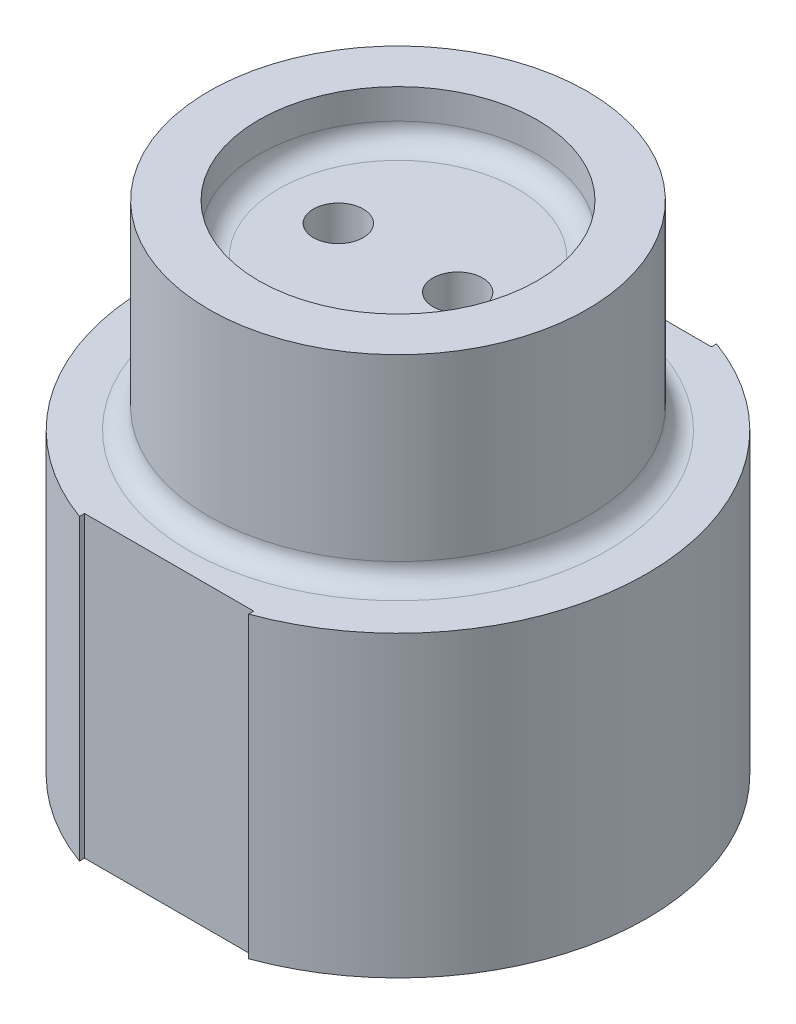
ISO-10303-21;
HEADER;
FILE_DESCRIPTION(('STEP AP214'),'2;1');
FILE_NAME('part.step','',(''),(''),'','','');
FILE_SCHEMA(('AUTOMOTIVE_DESIGN { 1 0 10303 214 1 1 1 1 }'));
ENDSEC;
DATA;
#1=APPLICATION_CONTEXT('core data for automotive mechanical design processes');
#2=APPLICATION_PROTOCOL_DEFINITION('international standard','automotive_design',2000,#1);
#3=PRODUCT_CONTEXT('',#1,'mechanical');
#4=PRODUCT('Part','Part','',(#3));
#5=PRODUCT_RELATED_PRODUCT_CATEGORY('part','',(#4));
#6=PRODUCT_DEFINITION_FORMATION('','',#4);
#7=PRODUCT_DEFINITION_CONTEXT('part definition',#1,'design');
#8=PRODUCT_DEFINITION('design','',#6,#7);
#9=PRODUCT_DEFINITION_SHAPE('','',#8);
#10=(LENGTH_UNIT() NAMED_UNIT(*) SI_UNIT(.MILLI.,.METRE.));
#11=(NAMED_UNIT(*) PLANE_ANGLE_UNIT() SI_UNIT($,.RADIAN.));
#12=(NAMED_UNIT(*) SI_UNIT($,.STERADIAN.) SOLID_ANGLE_UNIT());
#13=UNCERTAINTY_MEASURE_WITH_UNIT(LENGTH_MEASURE(1.E-05),#10,'distance_accuracy_value','');
#14=(GEOMETRIC_REPRESENTATION_CONTEXT(3) GLOBAL_UNCERTAINTY_ASSIGNED_CONTEXT((#13)) GLOBAL_UNIT_ASSIGNED_CONTEXT((#10,
#11,#12)) REPRESENTATION_CONTEXT('',''));
#15=CARTESIAN_POINT('',(0.,0.,0.));
#16=DIRECTION('',(0.,0.,1.));
#17=DIRECTION('',(1.,0.,0.));
#18=AXIS2_PLACEMENT_3D('',#15,#16,#17);
#19=CARTESIAN_POINT('',(0.,0.,0.));
#20=DIRECTION('',(0.,-1.,0.));
#21=DIRECTION('',(0.,0.,-1.));
#22=AXIS2_PLACEMENT_3D('',#19,#20,#21);
#23=PLANE('',#22);
#24=CARTESIAN_POINT('',(-1300.,0.,0.));
#25=DIRECTION('',(0.,-1.,0.));
#26=DIRECTION('',(0.,0.,1.));
#27=AXIS2_PLACEMENT_3D('',#24,#25,#26);
#28=CIRCLE('',#27,250.);
#29=CARTESIAN_POINT('',(-1300.,0.,250.));
#30=VERTEX_POINT('',#29);
#31=EDGE_CURVE('E181',#30,#30,#28,.T.);
#32=ORIENTED_EDGE('',*,*,#31,.F.);
#33=EDGE_LOOP('',(#32));
#34=FACE_BOUND('',#33,.T.);
#35=CARTESIAN_POINT('',(1300.,0.,0.));
#36=DIRECTION('',(0.,1.,0.));
#37=DIRECTION('',(0.,0.,1.));
#38=AXIS2_PLACEMENT_3D('',#35,#36,#37);
#39=CIRCLE('',#38,250.);
#40=CARTESIAN_POINT('',(1300.,0.,250.));
#41=VERTEX_POINT('',#40);
#42=EDGE_CURVE('E202',#41,#41,#39,.T.);
#43=ORIENTED_EDGE('',*,*,#42,.T.);
#44=EDGE_LOOP('',(#43));
#45=FACE_BOUND('',#44,.T.);
#46=CARTESIAN_POINT('',(0.,0.,0.));
#47=DIRECTION('',(0.,-1.,0.));
#48=DIRECTION('',(0.,0.,-1.));
#49=AXIS2_PLACEMENT_3D('',#46,#47,#48);
#50=CIRCLE('',#49,2500.);
#51=CARTESIAN_POINT('',(-850.,0.,2351.06358910175));
#52=VERTEX_POINT('',#51);
#53=CARTESIAN_POINT('',(-850.,0.,-2351.06358910175));
#54=VERTEX_POINT('',#53);
#55=EDGE_CURVE('E253',#52,#54,#50,.T.);
#56=ORIENTED_EDGE('',*,*,#55,.T.);
#57=DIRECTION('',(0.,0.,-1.));
#58=VECTOR('',#57,1.);
#59=CARTESIAN_POINT('',(-850.,0.,-2300.));
#60=LINE('',#59,#58);
#61=CARTESIAN_POINT('',(-850.,0.,-2300.));
#62=VERTEX_POINT('',#61);
#63=EDGE_CURVE('E135',#62,#54,#60,.T.);
#64=ORIENTED_EDGE('',*,*,#63,.F.);
#65=DIRECTION('',(1.,0.,0.));
#66=VECTOR('',#65,1.);
#67=CARTESIAN_POINT('',(-850.,0.,-2300.));
#68=LINE('',#67,#66);
#69=CARTESIAN_POINT('',(850.,0.,-2300.));
#70=VERTEX_POINT('',#69);
#71=EDGE_CURVE('E117',#62,#70,#68,.T.);
#72=ORIENTED_EDGE('',*,*,#71,.T.);
#73=DIRECTION('',(0.,0.,-1.));
#74=VECTOR('',#73,1.);
#75=CARTESIAN_POINT('',(850.,0.,-2300.));
#76=LINE('',#75,#74);
#77=CARTESIAN_POINT('',(850.,0.,-2351.06358910175));
#78=VERTEX_POINT('',#77);
#79=EDGE_CURVE('E114',#70,#78,#76,.T.);
#80=ORIENTED_EDGE('',*,*,#79,.T.);
#81=CARTESIAN_POINT('',(850.,0.,2351.06358910175));
#82=VERTEX_POINT('',#81);
#83=EDGE_CURVE('E252',#78,#82,#50,.T.);
#84=ORIENTED_EDGE('',*,*,#83,.T.);
#85=DIRECTION('',(0.,0.,1.));
#86=VECTOR('',#85,1.);
#87=CARTESIAN_POINT('',(850.,0.,2300.));
#88=LINE('',#87,#86);
#89=CARTESIAN_POINT('',(850.,0.,2300.));
#90=VERTEX_POINT('',#89);
#91=EDGE_CURVE('E167',#90,#82,#88,.T.);
#92=ORIENTED_EDGE('',*,*,#91,.F.);
#93=DIRECTION('',(1.,0.,0.));
#94=VECTOR('',#93,1.);
#95=CARTESIAN_POINT('',(-850.,0.,2300.));
#96=LINE('',#95,#94);
#97=CARTESIAN_POINT('',(-850.,0.,2300.));
#98=VERTEX_POINT('',#97);
#99=EDGE_CURVE('E151',#98,#90,#96,.T.);
#100=ORIENTED_EDGE('',*,*,#99,.F.);
#101=DIRECTION('',(0.,0.,1.));
#102=VECTOR('',#101,1.);
#103=CARTESIAN_POINT('',(-850.,0.,2300.));
#104=LINE('',#103,#102);
#105=EDGE_CURVE('E159',#98,#52,#104,.T.);
#106=ORIENTED_EDGE('',*,*,#105,.T.);
#107=EDGE_LOOP('',(#56,#64,#72,#80,#84,#92,#100,#106));
#108=FACE_BOUND('',#107,.T.);
#109=ADVANCED_FACE('F40',(#34,#45,#108),#23,.T.);
#110=CARTESIAN_POINT('',(0.,0.,0.));
#111=DIRECTION('',(0.,-1.,0.));
#112=DIRECTION('',(0.,0.,-1.));
#113=AXIS2_PLACEMENT_3D('',#110,#111,#112);
#114=CYLINDRICAL_SURFACE('',#113,2500.);
#115=CARTESIAN_POINT('',(0.,3000.,0.));
#116=DIRECTION('',(0.,-1.,0.));
#117=DIRECTION('',(0.,0.,-1.));
#118=AXIS2_PLACEMENT_3D('',#115,#116,#117);
#119=CIRCLE('',#118,2500.);
#120=CARTESIAN_POINT('',(-850.,3000.,2351.06358910175));
#121=VERTEX_POINT('',#120);
#122=CARTESIAN_POINT('',(-850.,3000.,-2351.06358910175));
#123=VERTEX_POINT('',#122);
#124=EDGE_CURVE('E248',#121,#123,#119,.T.);
#125=ORIENTED_EDGE('',*,*,#124,.T.);
#126=DIRECTION('',(0.,-1.,0.));
#127=VECTOR('',#126,1.);
#128=CARTESIAN_POINT('',(-850.,0.,-2351.06358910175));
#129=LINE('',#128,#127);
#130=EDGE_CURVE('E143',#123,#54,#129,.T.);
#131=ORIENTED_EDGE('',*,*,#130,.T.);
#132=ORIENTED_EDGE('',*,*,#55,.F.);
#133=DIRECTION('',(0.,-1.,0.));
#134=VECTOR('',#133,1.);
#135=CARTESIAN_POINT('',(-850.,0.,2351.06358910175));
#136=LINE('',#135,#134);
#137=EDGE_CURVE('E177',#121,#52,#136,.T.);
#138=ORIENTED_EDGE('',*,*,#137,.F.);
#139=EDGE_LOOP('',(#125,#131,#132,#138));
#140=FACE_BOUND('',#139,.T.);
#141=ADVANCED_FACE('F299',(#140),#114,.T.);
#142=ORIENTED_EDGE('',*,*,#83,.F.);
#143=DIRECTION('',(0.,-1.,0.));
#144=VECTOR('',#143,1.);
#145=CARTESIAN_POINT('',(850.,0.,-2351.06358910175));
#146=LINE('',#145,#144);
#147=CARTESIAN_POINT('',(850.,3000.,-2351.06358910175));
#148=VERTEX_POINT('',#147);
#149=EDGE_CURVE('E140',#78,#148,#146,.F.);
#150=ORIENTED_EDGE('',*,*,#149,.T.);
#151=CARTESIAN_POINT('',(850.,3000.,2351.06358910175));
#152=VERTEX_POINT('',#151);
#153=EDGE_CURVE('E129',#148,#152,#119,.T.);
#154=ORIENTED_EDGE('',*,*,#153,.T.);
#155=DIRECTION('',(0.,-1.,0.));
#156=VECTOR('',#155,1.);
#157=CARTESIAN_POINT('',(850.,0.,2351.06358910175));
#158=LINE('',#157,#156);
#159=EDGE_CURVE('E163',#82,#152,#158,.F.);
#160=ORIENTED_EDGE('',*,*,#159,.F.);
#161=EDGE_LOOP('',(#142,#150,#154,#160));
#162=FACE_BOUND('',#161,.T.);
#163=ADVANCED_FACE('F305',(#162),#114,.T.);
#164=CARTESIAN_POINT('',(2500.,3000.,0.));
#165=DIRECTION('',(0.,1.,0.));
#166=DIRECTION('',(0.,0.,1.));
#167=AXIS2_PLACEMENT_3D('',#164,#165,#166);
#168=PLANE('',#167);
#169=CARTESIAN_POINT('',(0.,3000.,0.));
#170=DIRECTION('',(0.,1.,0.));
#171=DIRECTION('',(0.,0.,1.));
#172=AXIS2_PLACEMENT_3D('',#169,#170,#171);
#173=CIRCLE('',#172,2100.);
#174=CARTESIAN_POINT('',(0.,3000.,2100.));
#175=VERTEX_POINT('',#174);
#176=EDGE_CURVE('E50',#175,#175,#173,.F.);
#177=ORIENTED_EDGE('',*,*,#176,.T.);
#178=EDGE_LOOP('',(#177));
#179=FACE_BOUND('',#178,.T.);
#180=DIRECTION('',(-1.,0.,0.));
#181=VECTOR('',#180,1.);
#182=CARTESIAN_POINT('',(-850.,3000.,-2300.));
#183=LINE('',#182,#181);
#184=CARTESIAN_POINT('',(850.,3000.,-2300.));
#185=VERTEX_POINT('',#184);
#186=CARTESIAN_POINT('',(-850.,3000.,-2300.));
#187=VERTEX_POINT('',#186);
#188=EDGE_CURVE('E118',#185,#187,#183,.T.);
#189=ORIENTED_EDGE('',*,*,#188,.T.);
#190=DIRECTION('',(0.,0.,-1.));
#191=VECTOR('',#190,1.);
#192=CARTESIAN_POINT('',(-850.,3000.,-2300.));
#193=LINE('',#192,#191);
#194=EDGE_CURVE('E131',#187,#123,#193,.T.);
#195=ORIENTED_EDGE('',*,*,#194,.T.);
#196=ORIENTED_EDGE('',*,*,#124,.F.);
#197=DIRECTION('',(0.,0.,1.));
#198=VECTOR('',#197,1.);
#199=CARTESIAN_POINT('',(-850.,3000.,2300.));
#200=LINE('',#199,#198);
#201=CARTESIAN_POINT('',(-850.,3000.,2300.));
#202=VERTEX_POINT('',#201);
#203=EDGE_CURVE('E160',#202,#121,#200,.T.);
#204=ORIENTED_EDGE('',*,*,#203,.F.);
#205=DIRECTION('',(-1.,0.,0.));
#206=VECTOR('',#205,1.);
#207=CARTESIAN_POINT('',(-850.,3000.,2300.));
#208=LINE('',#207,#206);
#209=CARTESIAN_POINT('',(850.,3000.,2300.));
#210=VERTEX_POINT('',#209);
#211=EDGE_CURVE('E156',#210,#202,#208,.T.);
#212=ORIENTED_EDGE('',*,*,#211,.F.);
#213=DIRECTION('',(0.,0.,1.));
#214=VECTOR('',#213,1.);
#215=CARTESIAN_POINT('',(850.,3000.,2300.));
#216=LINE('',#215,#214);
#217=EDGE_CURVE('E164',#210,#152,#216,.T.);
#218=ORIENTED_EDGE('',*,*,#217,.T.);
#219=ORIENTED_EDGE('',*,*,#153,.F.);
#220=DIRECTION('',(0.,0.,-1.));
#221=VECTOR('',#220,1.);
#222=CARTESIAN_POINT('',(850.,3000.,-2300.));
#223=LINE('',#222,#221);
#224=EDGE_CURVE('E111',#185,#148,#223,.T.);
#225=ORIENTED_EDGE('',*,*,#224,.F.);
#226=EDGE_LOOP('',(#189,#195,#196,#204,#212,#218,#219,#225));
#227=FACE_BOUND('',#226,.T.);
#228=ADVANCED_FACE('F127',(#179,#227),#168,.T.);
#229=CARTESIAN_POINT('',(0.,0.,0.));
#230=DIRECTION('',(0.,-1.,0.));
#231=DIRECTION('',(0.,0.,-1.));
#232=AXIS2_PLACEMENT_3D('',#229,#230,#231);
#233=CYLINDRICAL_SURFACE('',#232,1900.);
#234=CARTESIAN_POINT('',(0.,3200.,0.));
#235=DIRECTION('',(0.,1.,0.));
#236=DIRECTION('',(0.,0.,1.));
#237=AXIS2_PLACEMENT_3D('',#234,#235,#236);
#238=CIRCLE('',#237,1900.);
#239=CARTESIAN_POINT('',(0.,3200.,1900.));
#240=VERTEX_POINT('',#239);
#241=EDGE_CURVE('E11',#240,#240,#238,.T.);
#242=ORIENTED_EDGE('',*,*,#241,.T.);
#243=EDGE_LOOP('',(#242));
#244=FACE_BOUND('',#243,.T.);
#245=CARTESIAN_POINT('',(0.,5000.,0.));
#246=DIRECTION('',(0.,-1.,0.));
#247=DIRECTION('',(0.,0.,-1.));
#248=AXIS2_PLACEMENT_3D('',#245,#246,#247);
#249=CIRCLE('',#248,1900.);
#250=CARTESIAN_POINT('',(0.,5000.,-1900.));
#251=VERTEX_POINT('',#250);
#252=EDGE_CURVE('E244',#251,#251,#249,.T.);
#253=ORIENTED_EDGE('',*,*,#252,.T.);
#254=EDGE_LOOP('',(#253));
#255=FACE_BOUND('',#254,.T.);
#256=ADVANCED_FACE('F313',(#244,#255),#233,.T.);
#257=CARTESIAN_POINT('',(1900.,5000.,0.));
#258=DIRECTION('',(0.,1.,0.));
#259=DIRECTION('',(0.,0.,1.));
#260=AXIS2_PLACEMENT_3D('',#257,#258,#259);
#261=PLANE('',#260);
#262=CARTESIAN_POINT('',(0.,5000.,0.));
#263=DIRECTION('',(0.,-1.,0.));
#264=DIRECTION('',(0.,0.,-1.));
#265=AXIS2_PLACEMENT_3D('',#262,#263,#264);
#266=CIRCLE('',#265,1400.);
#267=CARTESIAN_POINT('',(0.,5000.,-1400.));
#268=VERTEX_POINT('',#267);
#269=EDGE_CURVE('E240',#268,#268,#266,.T.);
#270=ORIENTED_EDGE('',*,*,#269,.T.);
#271=EDGE_LOOP('',(#270));
#272=FACE_BOUND('',#271,.T.);
#273=ORIENTED_EDGE('',*,*,#252,.F.);
#274=EDGE_LOOP('',(#273));
#275=FACE_BOUND('',#274,.T.);
#276=ADVANCED_FACE('F316',(#272,#275),#261,.T.);
#277=CARTESIAN_POINT('',(0.,0.,0.));
#278=DIRECTION('',(0.,-1.,0.));
#279=DIRECTION('',(0.,0.,-1.));
#280=AXIS2_PLACEMENT_3D('',#277,#278,#279);
#281=CYLINDRICAL_SURFACE('',#280,1400.);
#282=CARTESIAN_POINT('',(0.,4700.,0.));
#283=DIRECTION('',(0.,1.,0.));
#284=DIRECTION('',(0.,0.,1.));
#285=AXIS2_PLACEMENT_3D('',#282,#283,#284);
#286=CIRCLE('',#285,1400.);
#287=CARTESIAN_POINT('',(0.,4700.,1400.));
#288=VERTEX_POINT('',#287);
#289=EDGE_CURVE('E281',#288,#288,#286,.F.);
#290=ORIENTED_EDGE('',*,*,#289,.T.);
#291=EDGE_LOOP('',(#290));
#292=FACE_BOUND('',#291,.T.);
#293=ORIENTED_EDGE('',*,*,#269,.F.);
#294=EDGE_LOOP('',(#293));
#295=FACE_BOUND('',#294,.T.);
#296=ADVANCED_FACE('F320',(#292,#295),#281,.F.);
#297=CARTESIAN_POINT('',(0.,4500.,0.));
#298=DIRECTION('',(0.,1.,0.));
#299=DIRECTION('',(0.,0.,1.));
#300=AXIS2_PLACEMENT_3D('',#297,#298,#299);
#301=PLANE('',#300);
#302=CARTESIAN_POINT('',(0.,4500.,0.));
#303=DIRECTION('',(0.,1.,0.));
#304=DIRECTION('',(0.,0.,1.));
#305=AXIS2_PLACEMENT_3D('',#302,#303,#304);
#306=CIRCLE('',#305,1200.);
#307=CARTESIAN_POINT('',(0.,4500.,1200.));
#308=VERTEX_POINT('',#307);
#309=EDGE_CURVE('E274',#308,#308,#306,.T.);
#310=ORIENTED_EDGE('',*,*,#309,.T.);
#311=EDGE_LOOP('',(#310));
#312=FACE_BOUND('',#311,.T.);
#313=CARTESIAN_POINT('',(-600.,4500.,0.));
#314=DIRECTION('',(0.,1.,0.));
#315=DIRECTION('',(0.,0.,1.));
#316=AXIS2_PLACEMENT_3D('',#313,#314,#315);
#317=CIRCLE('',#316,250.);
#318=CARTESIAN_POINT('',(-600.,4500.,250.));
#319=VERTEX_POINT('',#318);
#320=EDGE_CURVE('E180',#319,#319,#317,.F.);
#321=ORIENTED_EDGE('',*,*,#320,.T.);
#322=EDGE_LOOP('',(#321));
#323=FACE_BOUND('',#322,.T.);
#324=CARTESIAN_POINT('',(600.,4500.,0.));
#325=DIRECTION('',(0.,1.,0.));
#326=DIRECTION('',(0.,0.,1.));
#327=AXIS2_PLACEMENT_3D('',#324,#325,#326);
#328=CIRCLE('',#327,250.);
#329=CARTESIAN_POINT('',(600.,4500.,250.));
#330=VERTEX_POINT('',#329);
#331=EDGE_CURVE('E207',#330,#330,#328,.T.);
#332=ORIENTED_EDGE('',*,*,#331,.F.);
#333=EDGE_LOOP('',(#332));
#334=FACE_BOUND('',#333,.T.);
#335=ADVANCED_FACE('F324',(#312,#323,#334),#301,.T.);
#336=CARTESIAN_POINT('',(600.,4500.,0.));
#337=DIRECTION('',(0.,-1.,0.));
#338=DIRECTION('',(1.,0.,0.));
#339=AXIS2_PLACEMENT_3D('',#336,#337,#338);
#340=CYLINDRICAL_SURFACE('',#339,250.);
#341=CARTESIAN_POINT('',(600.,2000.,0.));
#342=DIRECTION('',(0.707106781186547,-0.707106781186548,0.));
#343=DIRECTION('',(-0.707106781186548,-0.707106781186547,0.));
#344=AXIS2_PLACEMENT_3D('',#341,#342,#343);
#345=ELLIPSE('',#344,353.553390593274,250.);
#346=CARTESIAN_POINT('',(350.,1750.,0.));
#347=VERTEX_POINT('',#346);
#348=EDGE_CURVE('E208',#347,#347,#345,.F.);
#349=ORIENTED_EDGE('',*,*,#348,.F.);
#350=EDGE_LOOP('',(#349));
#351=FACE_BOUND('',#350,.T.);
#352=ORIENTED_EDGE('',*,*,#331,.T.);
#353=EDGE_LOOP('',(#352));
#354=FACE_BOUND('',#353,.T.);
#355=ADVANCED_FACE('F343',(#351,#354),#340,.F.);
#356=CARTESIAN_POINT('',(49.9000000000001,2000.,0.));
#357=DIRECTION('',(1.,0.,0.));
#358=DIRECTION('',(0.,0.,-1.));
#359=AXIS2_PLACEMENT_3D('',#356,#357,#358);
#360=CYLINDRICAL_SURFACE('',#359,250.);
#361=ORIENTED_EDGE('',*,*,#348,.T.);
#362=EDGE_LOOP('',(#361));
#363=FACE_BOUND('',#362,.T.);
#364=CARTESIAN_POINT('',(1300.,2000.,0.));
#365=DIRECTION('',(0.707106781186548,-0.707106781186547,0.));
#366=DIRECTION('',(0.707106781186547,0.707106781186548,0.));
#367=AXIS2_PLACEMENT_3D('',#364,#365,#366);
#368=ELLIPSE('',#367,353.553390593274,250.);
#369=CARTESIAN_POINT('',(1550.,2250.,0.));
#370=VERTEX_POINT('',#369);
#371=EDGE_CURVE('E213',#370,#370,#368,.F.);
#372=ORIENTED_EDGE('',*,*,#371,.F.);
#373=EDGE_LOOP('',(#372));
#374=FACE_BOUND('',#373,.T.);
#375=ADVANCED_FACE('F364',(#363,#374),#360,.F.);
#376=CARTESIAN_POINT('',(1300.,2550.1,0.));
#377=DIRECTION('',(0.,-1.,0.));
#378=DIRECTION('',(1.,0.,0.));
#379=AXIS2_PLACEMENT_3D('',#376,#377,#378);
#380=CYLINDRICAL_SURFACE('',#379,250.);
#381=ORIENTED_EDGE('',*,*,#371,.T.);
#382=EDGE_LOOP('',(#381));
#383=FACE_BOUND('',#382,.T.);
#384=ORIENTED_EDGE('',*,*,#42,.F.);
#385=EDGE_LOOP('',(#384));
#386=FACE_BOUND('',#385,.T.);
#387=ADVANCED_FACE('F360',(#383,#386),#380,.F.);
#388=CARTESIAN_POINT('',(-600.,4500.,0.));
#389=DIRECTION('',(0.,-1.,0.));
#390=DIRECTION('',(1.,0.,0.));
#391=AXIS2_PLACEMENT_3D('',#388,#389,#390);
#392=CYLINDRICAL_SURFACE('',#391,250.);
#393=CARTESIAN_POINT('',(-600.,2000.,0.));
#394=DIRECTION('',(-0.707106781186547,-0.707106781186548,0.));
#395=DIRECTION('',(0.707106781186548,-0.707106781186547,0.));
#396=AXIS2_PLACEMENT_3D('',#393,#394,#395);
#397=ELLIPSE('',#396,353.553390593274,250.);
#398=CARTESIAN_POINT('',(-350.,1750.,0.));
#399=VERTEX_POINT('',#398);
#400=EDGE_CURVE('E186',#399,#399,#397,.F.);
#401=ORIENTED_EDGE('',*,*,#400,.F.);
#402=EDGE_LOOP('',(#401));
#403=FACE_BOUND('',#402,.T.);
#404=ORIENTED_EDGE('',*,*,#320,.F.);
#405=EDGE_LOOP('',(#404));
#406=FACE_BOUND('',#405,.T.);
#407=ADVANCED_FACE('F363',(#403,#406),#392,.F.);
#408=CARTESIAN_POINT('',(-49.9000000000001,2000.,0.));
#409=DIRECTION('',(-1.,0.,0.));
#410=DIRECTION('',(0.,0.,1.));
#411=AXIS2_PLACEMENT_3D('',#408,#409,#410);
#412=CYLINDRICAL_SURFACE('',#411,250.);
#413=ORIENTED_EDGE('',*,*,#400,.T.);
#414=EDGE_LOOP('',(#413));
#415=FACE_BOUND('',#414,.T.);
#416=CARTESIAN_POINT('',(-1300.,2000.,0.));
#417=DIRECTION('',(-0.707106781186548,-0.707106781186547,0.));
#418=DIRECTION('',(-0.707106781186547,0.707106781186548,0.));
#419=AXIS2_PLACEMENT_3D('',#416,#417,#418);
#420=ELLIPSE('',#419,353.553390593274,250.);
#421=CARTESIAN_POINT('',(-1550.,2250.,0.));
#422=VERTEX_POINT('',#421);
#423=EDGE_CURVE('E191',#422,#422,#420,.F.);
#424=ORIENTED_EDGE('',*,*,#423,.F.);
#425=EDGE_LOOP('',(#424));
#426=FACE_BOUND('',#425,.T.);
#427=ADVANCED_FACE('F387',(#415,#426),#412,.F.);
#428=CARTESIAN_POINT('',(-1300.,2550.1,0.));
#429=DIRECTION('',(0.,-1.,0.));
#430=DIRECTION('',(1.,0.,0.));
#431=AXIS2_PLACEMENT_3D('',#428,#429,#430);
#432=CYLINDRICAL_SURFACE('',#431,250.);
#433=ORIENTED_EDGE('',*,*,#423,.T.);
#434=EDGE_LOOP('',(#433));
#435=FACE_BOUND('',#434,.T.);
#436=ORIENTED_EDGE('',*,*,#31,.T.);
#437=EDGE_LOOP('',(#436));
#438=FACE_BOUND('',#437,.T.);
#439=ADVANCED_FACE('F383',(#435,#438),#432,.F.);
#440=CARTESIAN_POINT('',(-850.,0.,2300.));
#441=DIRECTION('',(-1.,0.,0.));
#442=DIRECTION('',(0.,0.,1.));
#443=AXIS2_PLACEMENT_3D('',#440,#441,#442);
#444=PLANE('',#443);
#445=ORIENTED_EDGE('',*,*,#137,.T.);
#446=ORIENTED_EDGE('',*,*,#105,.F.);
#447=DIRECTION('',(0.,-1.,0.));
#448=VECTOR('',#447,1.);
#449=CARTESIAN_POINT('',(-850.,0.,2300.));
#450=LINE('',#449,#448);
#451=EDGE_CURVE('E147',#202,#98,#450,.T.);
#452=ORIENTED_EDGE('',*,*,#451,.F.);
#453=ORIENTED_EDGE('',*,*,#203,.T.);
#454=EDGE_LOOP('',(#445,#446,#452,#453));
#455=FACE_BOUND('',#454,.T.);
#456=ADVANCED_FACE('F386',(#455),#444,.F.);
#457=CARTESIAN_POINT('',(850.,0.,2300.));
#458=DIRECTION('',(1.,0.,0.));
#459=DIRECTION('',(0.,0.,-1.));
#460=AXIS2_PLACEMENT_3D('',#457,#458,#459);
#461=PLANE('',#460);
#462=ORIENTED_EDGE('',*,*,#159,.T.);
#463=ORIENTED_EDGE('',*,*,#217,.F.);
#464=DIRECTION('',(0.,1.,0.));
#465=VECTOR('',#464,1.);
#466=CARTESIAN_POINT('',(850.,0.,2300.));
#467=LINE('',#466,#465);
#468=EDGE_CURVE('E65',#90,#210,#467,.T.);
#469=ORIENTED_EDGE('',*,*,#468,.F.);
#470=ORIENTED_EDGE('',*,*,#91,.T.);
#471=EDGE_LOOP('',(#462,#463,#469,#470));
#472=FACE_BOUND('',#471,.T.);
#473=ADVANCED_FACE('F397',(#472),#461,.F.);
#474=CARTESIAN_POINT('',(0.,0.,2300.));
#475=DIRECTION('',(0.,0.,-1.));
#476=DIRECTION('',(-1.,0.,0.));
#477=AXIS2_PLACEMENT_3D('',#474,#475,#476);
#478=PLANE('',#477);
#479=ORIENTED_EDGE('',*,*,#451,.T.);
#480=ORIENTED_EDGE('',*,*,#99,.T.);
#481=ORIENTED_EDGE('',*,*,#468,.T.);
#482=ORIENTED_EDGE('',*,*,#211,.T.);
#483=EDGE_LOOP('',(#479,#480,#481,#482));
#484=FACE_BOUND('',#483,.T.);
#485=ADVANCED_FACE('F401',(#484),#478,.F.);
#486=CARTESIAN_POINT('',(-850.,0.,-2300.));
#487=DIRECTION('',(1.,0.,0.));
#488=DIRECTION('',(0.,0.,-1.));
#489=AXIS2_PLACEMENT_3D('',#486,#487,#488);
#490=PLANE('',#489);
#491=ORIENTED_EDGE('',*,*,#194,.F.);
#492=DIRECTION('',(0.,-1.,0.));
#493=VECTOR('',#492,1.);
#494=CARTESIAN_POINT('',(-850.,0.,-2300.));
#495=LINE('',#494,#493);
#496=EDGE_CURVE('E57',#187,#62,#495,.T.);
#497=ORIENTED_EDGE('',*,*,#496,.T.);
#498=ORIENTED_EDGE('',*,*,#63,.T.);
#499=ORIENTED_EDGE('',*,*,#130,.F.);
#500=EDGE_LOOP('',(#491,#497,#498,#499));
#501=FACE_BOUND('',#500,.T.);
#502=ADVANCED_FACE('F405',(#501),#490,.T.);
#503=CARTESIAN_POINT('',(850.,0.,-2300.));
#504=DIRECTION('',(-1.,0.,0.));
#505=DIRECTION('',(0.,0.,1.));
#506=AXIS2_PLACEMENT_3D('',#503,#504,#505);
#507=PLANE('',#506);
#508=ORIENTED_EDGE('',*,*,#79,.F.);
#509=DIRECTION('',(0.,1.,0.));
#510=VECTOR('',#509,1.);
#511=CARTESIAN_POINT('',(850.,0.,-2300.));
#512=LINE('',#511,#510);
#513=EDGE_CURVE('E108',#70,#185,#512,.T.);
#514=ORIENTED_EDGE('',*,*,#513,.T.);
#515=ORIENTED_EDGE('',*,*,#224,.T.);
#516=ORIENTED_EDGE('',*,*,#149,.F.);
#517=EDGE_LOOP('',(#508,#514,#515,#516));
#518=FACE_BOUND('',#517,.T.);
#519=ADVANCED_FACE('F109',(#518),#507,.T.);
#520=CARTESIAN_POINT('',(0.,0.,-2300.));
#521=DIRECTION('',(0.,0.,1.));
#522=DIRECTION('',(-1.,0.,0.));
#523=AXIS2_PLACEMENT_3D('',#520,#521,#522);
#524=PLANE('',#523);
#525=ORIENTED_EDGE('',*,*,#496,.F.);
#526=ORIENTED_EDGE('',*,*,#188,.F.);
#527=ORIENTED_EDGE('',*,*,#513,.F.);
#528=ORIENTED_EDGE('',*,*,#71,.F.);
#529=EDGE_LOOP('',(#525,#526,#527,#528));
#530=FACE_BOUND('',#529,.T.);
#531=ADVANCED_FACE('F121',(#530),#524,.F.);
#532=CARTESIAN_POINT('',(0.,4700.,0.));
#533=DIRECTION('',(0.,1.,0.));
#534=DIRECTION('',(0.,0.,1.));
#535=AXIS2_PLACEMENT_3D('',#532,#533,#534);
#536=TOROIDAL_SURFACE('',#535,1200.,200.);
#537=ORIENTED_EDGE('',*,*,#289,.F.);
#538=EDGE_LOOP('',(#537));
#539=FACE_BOUND('',#538,.T.);
#540=ORIENTED_EDGE('',*,*,#309,.F.);
#541=EDGE_LOOP('',(#540));
#542=FACE_BOUND('',#541,.T.);
#543=ADVANCED_FACE('F290',(#539,#542),#536,.F.);
#544=CARTESIAN_POINT('',(0.,3200.,0.));
#545=DIRECTION('',(0.,1.,0.));
#546=DIRECTION('',(0.,0.,1.));
#547=AXIS2_PLACEMENT_3D('',#544,#545,#546);
#548=TOROIDAL_SURFACE('',#547,2100.,200.);
#549=ORIENTED_EDGE('',*,*,#241,.F.);
#550=EDGE_LOOP('',(#549));
#551=FACE_BOUND('',#550,.T.);
#552=ORIENTED_EDGE('',*,*,#176,.F.);
#553=EDGE_LOOP('',(#552));
#554=FACE_BOUND('',#553,.T.);
#555=ADVANCED_FACE('F42',(#551,#554),#548,.F.);
#556=CLOSED_SHELL('',(#109,#141,#163,#228,#256,#276,#296,#335,#355,#375,#387,#407,#427,#439,
#456,#473,#485,#502,#519,#531,#543,#555));
#557=CARTESIAN_POINT('',(0.,4200.,0.));
#558=DIRECTION('',(0.,1.,0.));
#559=DIRECTION('',(0.,0.,1.));
#560=AXIS2_PLACEMENT_3D('',#557,#558,#559);
#561=PLANE('',#560);
#562=CARTESIAN_POINT('',(600.,4200.,0.));
#563=DIRECTION('',(0.,1.,0.));
#564=DIRECTION('',(0.,0.,1.));
#565=AXIS2_PLACEMENT_3D('',#562,#563,#564);
#566=CIRCLE('',#565,350.);
#567=CARTESIAN_POINT('',(600.,4200.,350.));
#568=VERTEX_POINT('',#567);
#569=EDGE_CURVE('E257',#568,#568,#566,.F.);
#570=ORIENTED_EDGE('',*,*,#569,.F.);
#571=EDGE_LOOP('',(#570));
#572=FACE_BOUND('',#571,.T.);
#573=CARTESIAN_POINT('',(0.,4200.,0.));
#574=DIRECTION('',(0.,1.,0.));
#575=DIRECTION('',(0.,0.,1.));
#576=AXIS2_PLACEMENT_3D('',#573,#574,#575);
#577=CIRCLE('',#576,1400.);
#578=CARTESIAN_POINT('',(0.,4200.,1400.));
#579=VERTEX_POINT('',#578);
#580=EDGE_CURVE('E224',#579,#579,#577,.T.);
#581=ORIENTED_EDGE('',*,*,#580,.F.);
#582=EDGE_LOOP('',(#581));
#583=FACE_BOUND('',#582,.T.);
#584=CARTESIAN_POINT('',(-600.,4200.,0.));
#585=DIRECTION('',(0.,1.,0.));
#586=DIRECTION('',(0.,0.,1.));
#587=AXIS2_PLACEMENT_3D('',#584,#585,#586);
#588=CIRCLE('',#587,350.);
#589=CARTESIAN_POINT('',(-600.,4200.,350.));
#590=VERTEX_POINT('',#589);
#591=EDGE_CURVE('E264',#590,#590,#588,.F.);
#592=ORIENTED_EDGE('',*,*,#591,.F.);
#593=EDGE_LOOP('',(#592));
#594=FACE_BOUND('',#593,.T.);
#595=ADVANCED_FACE('F339',(#572,#583,#594),#561,.F.);
#596=CARTESIAN_POINT('',(0.,500.,0.));
#597=DIRECTION('',(0.,1.,0.));
#598=DIRECTION('',(0.,0.,1.));
#599=AXIS2_PLACEMENT_3D('',#596,#597,#598);
#600=PLANE('',#599);
#601=CARTESIAN_POINT('',(1300.,500.,0.));
#602=DIRECTION('',(0.,1.,0.));
#603=DIRECTION('',(0.,0.,1.));
#604=AXIS2_PLACEMENT_3D('',#601,#602,#603);
#605=CIRCLE('',#604,350.);
#606=CARTESIAN_POINT('',(1300.,500.,350.));
#607=VERTEX_POINT('',#606);
#608=EDGE_CURVE('E212',#607,#607,#605,.F.);
#609=ORIENTED_EDGE('',*,*,#608,.T.);
#610=EDGE_LOOP('',(#609));
#611=FACE_BOUND('',#610,.T.);
#612=CARTESIAN_POINT('',(0.,500.,0.));
#613=DIRECTION('',(0.,-1.,0.));
#614=DIRECTION('',(0.,0.,-1.));
#615=AXIS2_PLACEMENT_3D('',#612,#613,#614);
#616=CIRCLE('',#615,2000.);
#617=CARTESIAN_POINT('',(0.,500.,-2000.));
#618=VERTEX_POINT('',#617);
#619=EDGE_CURVE('E228',#618,#618,#616,.T.);
#620=ORIENTED_EDGE('',*,*,#619,.F.);
#621=EDGE_LOOP('',(#620));
#622=FACE_BOUND('',#621,.T.);
#623=CARTESIAN_POINT('',(-1300.,500.,0.));
#624=DIRECTION('',(0.,1.,0.));
#625=DIRECTION('',(0.,0.,1.));
#626=AXIS2_PLACEMENT_3D('',#623,#624,#625);
#627=CIRCLE('',#626,350.);
#628=CARTESIAN_POINT('',(-1300.,500.,350.));
#629=VERTEX_POINT('',#628);
#630=EDGE_CURVE('E190',#629,#629,#627,.F.);
#631=ORIENTED_EDGE('',*,*,#630,.T.);
#632=EDGE_LOOP('',(#631));
#633=FACE_BOUND('',#632,.T.);
#634=ADVANCED_FACE('F335',(#611,#622,#633),#600,.T.);
#635=CARTESIAN_POINT('',(0.,0.,0.));
#636=DIRECTION('',(0.,-1.,0.));
#637=DIRECTION('',(0.,0.,-1.));
#638=AXIS2_PLACEMENT_3D('',#635,#636,#637);
#639=CYLINDRICAL_SURFACE('',#638,2000.);
#640=ORIENTED_EDGE('',*,*,#619,.T.);
#641=EDGE_LOOP('',(#640));
#642=FACE_BOUND('',#641,.T.);
#643=CARTESIAN_POINT('',(0.,2500.,0.));
#644=DIRECTION('',(0.,-1.,0.));
#645=DIRECTION('',(0.,0.,-1.));
#646=AXIS2_PLACEMENT_3D('',#643,#644,#645);
#647=CIRCLE('',#646,2000.);
#648=CARTESIAN_POINT('',(0.,2500.,-2000.));
#649=VERTEX_POINT('',#648);
#650=EDGE_CURVE('E232',#649,#649,#647,.T.);
#651=ORIENTED_EDGE('',*,*,#650,.F.);
#652=EDGE_LOOP('',(#651));
#653=FACE_BOUND('',#652,.T.);
#654=ADVANCED_FACE('F330',(#642,#653),#639,.F.);
#655=CARTESIAN_POINT('',(2000.,2500.,0.));
#656=DIRECTION('',(0.,-1.,0.));
#657=DIRECTION('',(0.,0.,-1.));
#658=AXIS2_PLACEMENT_3D('',#655,#656,#657);
#659=PLANE('',#658);
#660=ORIENTED_EDGE('',*,*,#650,.T.);
#661=EDGE_LOOP('',(#660));
#662=FACE_BOUND('',#661,.T.);
#663=CARTESIAN_POINT('',(0.,2500.,0.));
#664=DIRECTION('',(0.,-1.,0.));
#665=DIRECTION('',(0.,0.,-1.));
#666=AXIS2_PLACEMENT_3D('',#663,#664,#665);
#667=CIRCLE('',#666,1400.);
#668=CARTESIAN_POINT('',(0.,2500.,-1400.));
#669=VERTEX_POINT('',#668);
#670=EDGE_CURVE('E236',#669,#669,#667,.T.);
#671=ORIENTED_EDGE('',*,*,#670,.F.);
#672=EDGE_LOOP('',(#671));
#673=FACE_BOUND('',#672,.T.);
#674=ADVANCED_FACE('F327',(#662,#673),#659,.T.);
#675=ORIENTED_EDGE('',*,*,#670,.T.);
#676=EDGE_LOOP('',(#675));
#677=FACE_BOUND('',#676,.T.);
#678=ORIENTED_EDGE('',*,*,#580,.T.);
#679=EDGE_LOOP('',(#678));
#680=FACE_BOUND('',#679,.T.);
#681=ADVANCED_FACE('F326',(#677,#680),#281,.F.);
#682=CARTESIAN_POINT('',(600.,4500.,0.));
#683=DIRECTION('',(0.,-1.,0.));
#684=DIRECTION('',(1.,0.,0.));
#685=AXIS2_PLACEMENT_3D('',#682,#683,#684);
#686=CYLINDRICAL_SURFACE('',#685,350.);
#687=CARTESIAN_POINT('',(600.,2000.,0.));
#688=DIRECTION('',(0.707106781186547,-0.707106781186548,0.));
#689=DIRECTION('',(-0.707106781186548,-0.707106781186547,0.));
#690=AXIS2_PLACEMENT_3D('',#687,#688,#689);
#691=ELLIPSE('',#690,494.974746830583,350.);
#692=CARTESIAN_POINT('',(250.,1650.,0.));
#693=VERTEX_POINT('',#692);
#694=EDGE_CURVE('E217',#693,#693,#691,.T.);
#695=ORIENTED_EDGE('',*,*,#694,.F.);
#696=EDGE_LOOP('',(#695));
#697=FACE_BOUND('',#696,.T.);
#698=ORIENTED_EDGE('',*,*,#569,.T.);
#699=EDGE_LOOP('',(#698));
#700=FACE_BOUND('',#699,.T.);
#701=ADVANCED_FACE('F351',(#697,#700),#686,.T.);
#702=CARTESIAN_POINT('',(1300.,2770.1,0.));
#703=DIRECTION('',(0.,-1.,0.));
#704=DIRECTION('',(1.,0.,0.));
#705=AXIS2_PLACEMENT_3D('',#702,#703,#704);
#706=CYLINDRICAL_SURFACE('',#705,350.);
#707=ORIENTED_EDGE('',*,*,#608,.F.);
#708=EDGE_LOOP('',(#707));
#709=FACE_BOUND('',#708,.T.);
#710=CARTESIAN_POINT('',(1300.,2000.,0.));
#711=DIRECTION('',(0.707106781186548,-0.707106781186547,0.));
#712=DIRECTION('',(0.707106781186547,0.707106781186548,0.));
#713=AXIS2_PLACEMENT_3D('',#710,#711,#712);
#714=ELLIPSE('',#713,494.974746830583,350.);
#715=CARTESIAN_POINT('',(1650.,2350.,0.));
#716=VERTEX_POINT('',#715);
#717=EDGE_CURVE('E206',#716,#716,#714,.T.);
#718=ORIENTED_EDGE('',*,*,#717,.T.);
#719=EDGE_LOOP('',(#718));
#720=FACE_BOUND('',#719,.T.);
#721=ADVANCED_FACE('F347',(#709,#720),#706,.T.);
#722=CARTESIAN_POINT('',(-170.1,2000.,0.));
#723=DIRECTION('',(1.,0.,0.));
#724=DIRECTION('',(0.,0.,-1.));
#725=AXIS2_PLACEMENT_3D('',#722,#723,#724);
#726=CYLINDRICAL_SURFACE('',#725,350.);
#727=ORIENTED_EDGE('',*,*,#694,.T.);
#728=EDGE_LOOP('',(#727));
#729=FACE_BOUND('',#728,.T.);
#730=ORIENTED_EDGE('',*,*,#717,.F.);
#731=EDGE_LOOP('',(#730));
#732=FACE_BOUND('',#731,.T.);
#733=ADVANCED_FACE('F350',(#729,#732),#726,.T.);
#734=CARTESIAN_POINT('',(-600.,4500.,0.));
#735=DIRECTION('',(0.,-1.,0.));
#736=DIRECTION('',(1.,0.,0.));
#737=AXIS2_PLACEMENT_3D('',#734,#735,#736);
#738=CYLINDRICAL_SURFACE('',#737,350.);
#739=CARTESIAN_POINT('',(-600.,2000.,0.));
#740=DIRECTION('',(-0.707106781186547,-0.707106781186548,0.));
#741=DIRECTION('',(0.707106781186548,-0.707106781186547,0.));
#742=AXIS2_PLACEMENT_3D('',#739,#740,#741);
#743=ELLIPSE('',#742,494.974746830583,350.);
#744=CARTESIAN_POINT('',(-250.,1650.,0.));
#745=VERTEX_POINT('',#744);
#746=EDGE_CURVE('E195',#745,#745,#743,.T.);
#747=ORIENTED_EDGE('',*,*,#746,.F.);
#748=EDGE_LOOP('',(#747));
#749=FACE_BOUND('',#748,.T.);
#750=ORIENTED_EDGE('',*,*,#591,.T.);
#751=EDGE_LOOP('',(#750));
#752=FACE_BOUND('',#751,.T.);
#753=ADVANCED_FACE('F353',(#749,#752),#738,.T.);
#754=CARTESIAN_POINT('',(-1300.,2770.1,0.));
#755=DIRECTION('',(0.,-1.,0.));
#756=DIRECTION('',(1.,0.,0.));
#757=AXIS2_PLACEMENT_3D('',#754,#755,#756);
#758=CYLINDRICAL_SURFACE('',#757,350.);
#759=ORIENTED_EDGE('',*,*,#630,.F.);
#760=EDGE_LOOP('',(#759));
#761=FACE_BOUND('',#760,.T.);
#762=CARTESIAN_POINT('',(-1300.,2000.,0.));
#763=DIRECTION('',(-0.707106781186548,-0.707106781186547,0.));
#764=DIRECTION('',(-0.707106781186547,0.707106781186548,0.));
#765=AXIS2_PLACEMENT_3D('',#762,#763,#764);
#766=ELLIPSE('',#765,494.974746830583,350.);
#767=CARTESIAN_POINT('',(-1650.,2350.,0.));
#768=VERTEX_POINT('',#767);
#769=EDGE_CURVE('E185',#768,#768,#766,.T.);
#770=ORIENTED_EDGE('',*,*,#769,.T.);
#771=EDGE_LOOP('',(#770));
#772=FACE_BOUND('',#771,.T.);
#773=ADVANCED_FACE('F372',(#761,#772),#758,.T.);
#774=CARTESIAN_POINT('',(170.1,2000.,0.));
#775=DIRECTION('',(-1.,0.,0.));
#776=DIRECTION('',(0.,0.,1.));
#777=AXIS2_PLACEMENT_3D('',#774,#775,#776);
#778=CYLINDRICAL_SURFACE('',#777,350.);
#779=ORIENTED_EDGE('',*,*,#746,.T.);
#780=EDGE_LOOP('',(#779));
#781=FACE_BOUND('',#780,.T.);
#782=ORIENTED_EDGE('',*,*,#769,.F.);
#783=EDGE_LOOP('',(#782));
#784=FACE_BOUND('',#783,.T.);
#785=ADVANCED_FACE('F375',(#781,#784),#778,.T.);
#786=CLOSED_SHELL('',(#595,#634,#654,#674,#681,#701,#721,#733,#753,#773,#785));
#787=ORIENTED_CLOSED_SHELL('',*,#786,.T.);
#788=BREP_WITH_VOIDS('B2',#556,(#787));
#789=ADVANCED_BREP_SHAPE_REPRESENTATION('',(#18,#788),#14);
#790=SHAPE_DEFINITION_REPRESENTATION(#9,#789);
ENDSEC;
END-ISO-10303-21;
